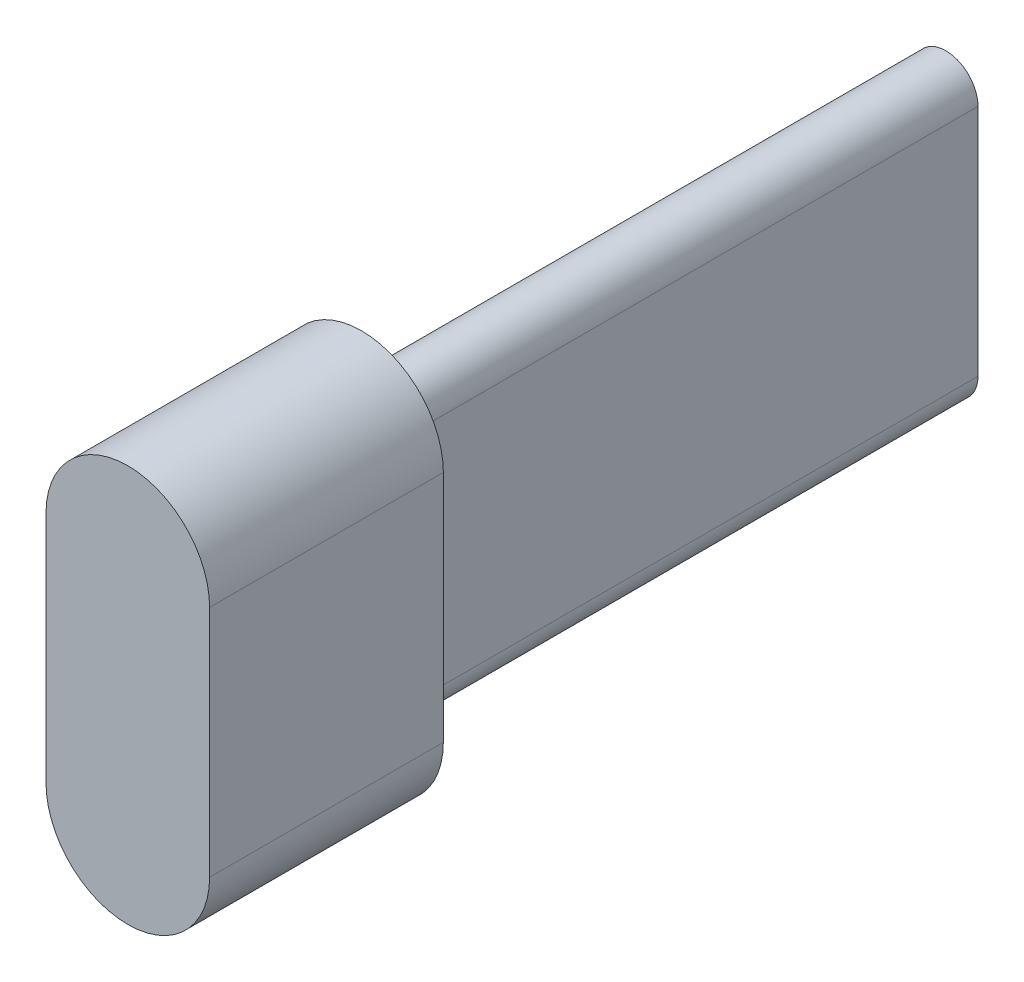
ISO-10303-21;
HEADER;
FILE_DESCRIPTION(('STEP AP214'),'2;1');
FILE_NAME('part.step','',(''),(''),'','','');
FILE_SCHEMA(('AUTOMOTIVE_DESIGN { 1 0 10303 214 1 1 1 1 }'));
ENDSEC;
DATA;
#1=APPLICATION_CONTEXT('core data for automotive mechanical design processes');
#2=APPLICATION_PROTOCOL_DEFINITION('international standard','automotive_design',2000,#1);
#3=PRODUCT_CONTEXT('',#1,'mechanical');
#4=PRODUCT('Part','Part','',(#3));
#5=PRODUCT_RELATED_PRODUCT_CATEGORY('part','',(#4));
#6=PRODUCT_DEFINITION_FORMATION('','',#4);
#7=PRODUCT_DEFINITION_CONTEXT('part definition',#1,'design');
#8=PRODUCT_DEFINITION('design','',#6,#7);
#9=PRODUCT_DEFINITION_SHAPE('','',#8);
#10=(LENGTH_UNIT() NAMED_UNIT(*) SI_UNIT(.MILLI.,.METRE.));
#11=(NAMED_UNIT(*) PLANE_ANGLE_UNIT() SI_UNIT($,.RADIAN.));
#12=(NAMED_UNIT(*) SI_UNIT($,.STERADIAN.) SOLID_ANGLE_UNIT());
#13=UNCERTAINTY_MEASURE_WITH_UNIT(LENGTH_MEASURE(1.E-05),#10,'distance_accuracy_value','');
#14=(GEOMETRIC_REPRESENTATION_CONTEXT(3) GLOBAL_UNCERTAINTY_ASSIGNED_CONTEXT((#13)) GLOBAL_UNIT_ASSIGNED_CONTEXT((#10,
#11,#12)) REPRESENTATION_CONTEXT('',''));
#15=CARTESIAN_POINT('',(0.,0.,0.));
#16=DIRECTION('',(0.,0.,1.));
#17=DIRECTION('',(1.,0.,0.));
#18=AXIS2_PLACEMENT_3D('',#15,#16,#17);
#19=CARTESIAN_POINT('',(-5.3532180263906,-26.1185094078407,-20.));
#20=DIRECTION('',(0.,0.,1.));
#21=DIRECTION('',(1.,0.,0.));
#22=AXIS2_PLACEMENT_3D('',#19,#20,#21);
#23=CYLINDRICAL_SURFACE('',#22,1.1);
#24=CARTESIAN_POINT('',(-5.3532180263906,-26.1185094078407,0.));
#25=DIRECTION('',(0.,0.,1.));
#26=DIRECTION('',(1.,0.,0.));
#27=AXIS2_PLACEMENT_3D('',#24,#25,#26);
#28=CIRCLE('',#27,1.1);
#29=CARTESIAN_POINT('',(-4.25321802639058,-26.1185094078407,0.));
#30=VERTEX_POINT('',#29);
#31=CARTESIAN_POINT('',(-6.45321802639058,-26.1185094078407,0.));
#32=VERTEX_POINT('',#31);
#33=EDGE_CURVE('E136',#30,#32,#28,.T.);
#34=ORIENTED_EDGE('',*,*,#33,.F.);
#35=DIRECTION('',(0.,0.,1.));
#36=VECTOR('',#35,1.);
#37=CARTESIAN_POINT('',(-4.25321802639058,-26.1185094078407,-20.));
#38=LINE('',#37,#36);
#39=CARTESIAN_POINT('',(-4.25321802639058,-26.1185094078407,-20.));
#40=VERTEX_POINT('',#39);
#41=EDGE_CURVE('E11',#40,#30,#38,.T.);
#42=ORIENTED_EDGE('',*,*,#41,.F.);
#43=CARTESIAN_POINT('',(-5.3532180263906,-26.1185094078407,-20.));
#44=DIRECTION('',(0.,0.,1.));
#45=DIRECTION('',(1.,0.,0.));
#46=AXIS2_PLACEMENT_3D('',#43,#44,#45);
#47=CIRCLE('',#46,1.1);
#48=CARTESIAN_POINT('',(-6.45321802639058,-26.1185094078407,-20.));
#49=VERTEX_POINT('',#48);
#50=EDGE_CURVE('E145',#40,#49,#47,.T.);
#51=ORIENTED_EDGE('',*,*,#50,.T.);
#52=DIRECTION('',(0.,0.,1.));
#53=VECTOR('',#52,1.);
#54=CARTESIAN_POINT('',(-6.45321802639058,-26.1185094078407,-20.));
#55=LINE('',#54,#53);
#56=EDGE_CURVE('E44',#49,#32,#55,.T.);
#57=ORIENTED_EDGE('',*,*,#56,.T.);
#58=EDGE_LOOP('',(#34,#42,#51,#57));
#59=FACE_BOUND('',#58,.T.);
#60=ADVANCED_FACE('F41',(#59),#23,.T.);
#61=CARTESIAN_POINT('',(-4.25321802639059,-34.1185094078407,-20.));
#62=DIRECTION('',(1.,0.,0.));
#63=DIRECTION('',(0.,1.,0.));
#64=AXIS2_PLACEMENT_3D('',#61,#62,#63);
#65=PLANE('',#64);
#66=DIRECTION('',(0.,1.,0.));
#67=VECTOR('',#66,1.);
#68=CARTESIAN_POINT('',(-4.25321802639059,-34.1185094078407,0.));
#69=LINE('',#68,#67);
#70=CARTESIAN_POINT('',(-4.25321802639061,-34.1185094078407,0.));
#71=VERTEX_POINT('',#70);
#72=EDGE_CURVE('E148',#71,#30,#69,.T.);
#73=ORIENTED_EDGE('',*,*,#72,.F.);
#74=DIRECTION('',(0.,0.,1.));
#75=VECTOR('',#74,1.);
#76=CARTESIAN_POINT('',(-4.25321802639061,-34.1185094078407,-20.));
#77=LINE('',#76,#75);
#78=CARTESIAN_POINT('',(-4.25321802639061,-34.1185094078407,-20.));
#79=VERTEX_POINT('',#78);
#80=EDGE_CURVE('E50',#79,#71,#77,.T.);
#81=ORIENTED_EDGE('',*,*,#80,.F.);
#82=DIRECTION('',(0.,1.,0.));
#83=VECTOR('',#82,1.);
#84=CARTESIAN_POINT('',(-4.25321802639059,-34.1185094078407,-20.));
#85=LINE('',#84,#83);
#86=EDGE_CURVE('E152',#79,#40,#85,.T.);
#87=ORIENTED_EDGE('',*,*,#86,.T.);
#88=ORIENTED_EDGE('',*,*,#41,.T.);
#89=EDGE_LOOP('',(#73,#81,#87,#88));
#90=FACE_BOUND('',#89,.T.);
#91=ADVANCED_FACE('F166',(#90),#65,.T.);
#92=CARTESIAN_POINT('',(-5.3532180263906,-34.1185094078407,-20.));
#93=DIRECTION('',(0.,0.,1.));
#94=DIRECTION('',(1.,0.,0.));
#95=AXIS2_PLACEMENT_3D('',#92,#93,#94);
#96=CYLINDRICAL_SURFACE('',#95,1.09999999999999);
#97=CARTESIAN_POINT('',(-5.3532180263906,-34.1185094078407,0.));
#98=DIRECTION('',(0.,0.,1.));
#99=DIRECTION('',(1.,0.,0.));
#100=AXIS2_PLACEMENT_3D('',#97,#98,#99);
#101=CIRCLE('',#100,1.09999999999999);
#102=CARTESIAN_POINT('',(-6.45321802639058,-34.1185094078407,0.));
#103=VERTEX_POINT('',#102);
#104=EDGE_CURVE('E157',#103,#71,#101,.T.);
#105=ORIENTED_EDGE('',*,*,#104,.F.);
#106=DIRECTION('',(0.,0.,1.));
#107=VECTOR('',#106,1.);
#108=CARTESIAN_POINT('',(-6.45321802639058,-34.1185094078407,-20.));
#109=LINE('',#108,#107);
#110=CARTESIAN_POINT('',(-6.45321802639058,-34.1185094078407,-20.));
#111=VERTEX_POINT('',#110);
#112=EDGE_CURVE('E73',#111,#103,#109,.T.);
#113=ORIENTED_EDGE('',*,*,#112,.F.);
#114=CARTESIAN_POINT('',(-5.3532180263906,-34.1185094078407,-20.));
#115=DIRECTION('',(0.,0.,1.));
#116=DIRECTION('',(1.,0.,0.));
#117=AXIS2_PLACEMENT_3D('',#114,#115,#116);
#118=CIRCLE('',#117,1.09999999999999);
#119=EDGE_CURVE('E150',#111,#79,#118,.T.);
#120=ORIENTED_EDGE('',*,*,#119,.T.);
#121=ORIENTED_EDGE('',*,*,#80,.T.);
#122=EDGE_LOOP('',(#105,#113,#120,#121));
#123=FACE_BOUND('',#122,.T.);
#124=ADVANCED_FACE('F171',(#123),#96,.T.);
#125=CARTESIAN_POINT('',(-6.45321802639058,-26.1185094078407,-20.));
#126=DIRECTION('',(-1.,0.,0.));
#127=DIRECTION('',(0.,0.,1.));
#128=AXIS2_PLACEMENT_3D('',#125,#126,#127);
#129=PLANE('',#128);
#130=DIRECTION('',(0.,-1.,0.));
#131=VECTOR('',#130,1.);
#132=CARTESIAN_POINT('',(-6.45321802639058,-26.1185094078407,0.));
#133=LINE('',#132,#131);
#134=EDGE_CURVE('E139',#32,#103,#133,.T.);
#135=ORIENTED_EDGE('',*,*,#134,.F.);
#136=ORIENTED_EDGE('',*,*,#56,.F.);
#137=DIRECTION('',(0.,-1.,0.));
#138=VECTOR('',#137,1.);
#139=CARTESIAN_POINT('',(-6.45321802639058,-26.1185094078407,-20.));
#140=LINE('',#139,#138);
#141=EDGE_CURVE('E147',#49,#111,#140,.T.);
#142=ORIENTED_EDGE('',*,*,#141,.T.);
#143=ORIENTED_EDGE('',*,*,#112,.T.);
#144=EDGE_LOOP('',(#135,#136,#142,#143));
#145=FACE_BOUND('',#144,.T.);
#146=ADVANCED_FACE('F162',(#145),#129,.T.);
#147=CARTESIAN_POINT('',(-5.3532180263906,-26.1185094078407,-20.));
#148=DIRECTION('',(0.,0.,1.));
#149=DIRECTION('',(1.,0.,0.));
#150=AXIS2_PLACEMENT_3D('',#147,#148,#149);
#151=PLANE('',#150);
#152=ORIENTED_EDGE('',*,*,#50,.F.);
#153=ORIENTED_EDGE('',*,*,#86,.F.);
#154=ORIENTED_EDGE('',*,*,#119,.F.);
#155=ORIENTED_EDGE('',*,*,#141,.F.);
#156=EDGE_LOOP('',(#152,#153,#154,#155));
#157=FACE_BOUND('',#156,.T.);
#158=ADVANCED_FACE('F170',(#157),#151,.F.);
#159=CARTESIAN_POINT('',(0.,0.,0.));
#160=DIRECTION('',(0.,0.,1.));
#161=DIRECTION('',(1.,0.,0.));
#162=AXIS2_PLACEMENT_3D('',#159,#160,#161);
#163=PLANE('',#162);
#164=DIRECTION('',(0.,1.,0.));
#165=VECTOR('',#164,1.);
#166=CARTESIAN_POINT('',(-2.55321802639055,0.,0.));
#167=LINE('',#166,#165);
#168=CARTESIAN_POINT('',(-2.55321802639064,-34.1185094078407,0.));
#169=VERTEX_POINT('',#168);
#170=CARTESIAN_POINT('',(-2.55321802639061,-26.1185094078407,0.));
#171=VERTEX_POINT('',#170);
#172=EDGE_CURVE('E135',#169,#171,#167,.T.);
#173=ORIENTED_EDGE('',*,*,#172,.F.);
#174=CARTESIAN_POINT('',(-5.3532180263906,-34.1185094078407,0.));
#175=DIRECTION('',(0.,0.,1.));
#176=DIRECTION('',(1.,0.,0.));
#177=AXIS2_PLACEMENT_3D('',#174,#175,#176);
#178=CIRCLE('',#177,2.79999999999996);
#179=CARTESIAN_POINT('',(-8.15321802639056,-34.1185094078407,0.));
#180=VERTEX_POINT('',#179);
#181=EDGE_CURVE('E131',#180,#169,#178,.T.);
#182=ORIENTED_EDGE('',*,*,#181,.F.);
#183=DIRECTION('',(0.,-1.,0.));
#184=VECTOR('',#183,1.);
#185=CARTESIAN_POINT('',(-8.15321802639056,0.,0.));
#186=LINE('',#185,#184);
#187=CARTESIAN_POINT('',(-8.15321802639056,-26.1185094078407,0.));
#188=VERTEX_POINT('',#187);
#189=EDGE_CURVE('E290',#188,#180,#186,.T.);
#190=ORIENTED_EDGE('',*,*,#189,.F.);
#191=CARTESIAN_POINT('',(-5.3532180263906,-26.1185094078407,0.));
#192=DIRECTION('',(0.,0.,1.));
#193=DIRECTION('',(1.,0.,0.));
#194=AXIS2_PLACEMENT_3D('',#191,#192,#193);
#195=CIRCLE('',#194,2.79999999999997);
#196=EDGE_CURVE('E293',#171,#188,#195,.T.);
#197=ORIENTED_EDGE('',*,*,#196,.F.);
#198=EDGE_LOOP('',(#173,#182,#190,#197));
#199=FACE_BOUND('',#198,.T.);
#200=ORIENTED_EDGE('',*,*,#72,.T.);
#201=ORIENTED_EDGE('',*,*,#33,.T.);
#202=ORIENTED_EDGE('',*,*,#134,.T.);
#203=ORIENTED_EDGE('',*,*,#104,.T.);
#204=EDGE_LOOP('',(#200,#201,#202,#203));
#205=FACE_BOUND('',#204,.T.);
#206=ADVANCED_FACE('F164',(#199,#205),#163,.F.);
#207=CARTESIAN_POINT('',(-2.55321802639055,0.,8.));
#208=DIRECTION('',(-1.,0.,0.));
#209=DIRECTION('',(0.,-1.,0.));
#210=AXIS2_PLACEMENT_3D('',#207,#208,#209);
#211=PLANE('',#210);
#212=ORIENTED_EDGE('',*,*,#172,.T.);
#213=DIRECTION('',(0.,0.,-1.));
#214=VECTOR('',#213,1.);
#215=CARTESIAN_POINT('',(-2.55321802639061,-26.1185094078407,8.));
#216=LINE('',#215,#214);
#217=CARTESIAN_POINT('',(-2.55321802639061,-26.1185094078407,8.));
#218=VERTEX_POINT('',#217);
#219=EDGE_CURVE('E115',#218,#171,#216,.T.);
#220=ORIENTED_EDGE('',*,*,#219,.F.);
#221=DIRECTION('',(0.,1.,0.));
#222=VECTOR('',#221,1.);
#223=CARTESIAN_POINT('',(-2.55321802639055,0.,8.));
#224=LINE('',#223,#222);
#225=CARTESIAN_POINT('',(-2.55321802639064,-34.1185094078407,8.));
#226=VERTEX_POINT('',#225);
#227=EDGE_CURVE('E122',#226,#218,#224,.T.);
#228=ORIENTED_EDGE('',*,*,#227,.F.);
#229=DIRECTION('',(0.,0.,-1.));
#230=VECTOR('',#229,1.);
#231=CARTESIAN_POINT('',(-2.55321802639064,-34.1185094078407,8.));
#232=LINE('',#231,#230);
#233=EDGE_CURVE('E287',#226,#169,#232,.T.);
#234=ORIENTED_EDGE('',*,*,#233,.T.);
#235=EDGE_LOOP('',(#212,#220,#228,#234));
#236=FACE_BOUND('',#235,.T.);
#237=ADVANCED_FACE('F133',(#236),#211,.F.);
#238=CARTESIAN_POINT('',(-5.3532180263906,-26.1185094078407,8.));
#239=DIRECTION('',(0.,0.,-1.));
#240=DIRECTION('',(-1.,0.,0.));
#241=AXIS2_PLACEMENT_3D('',#238,#239,#240);
#242=CYLINDRICAL_SURFACE('',#241,2.79999999999997);
#243=ORIENTED_EDGE('',*,*,#196,.T.);
#244=DIRECTION('',(0.,0.,-1.));
#245=VECTOR('',#244,1.);
#246=CARTESIAN_POINT('',(-8.15321802639056,-26.1185094078407,8.));
#247=LINE('',#246,#245);
#248=CARTESIAN_POINT('',(-8.15321802639056,-26.1185094078407,8.));
#249=VERTEX_POINT('',#248);
#250=EDGE_CURVE('E118',#249,#188,#247,.T.);
#251=ORIENTED_EDGE('',*,*,#250,.F.);
#252=CARTESIAN_POINT('',(-5.3532180263906,-26.1185094078407,8.));
#253=DIRECTION('',(0.,0.,1.));
#254=DIRECTION('',(1.,0.,0.));
#255=AXIS2_PLACEMENT_3D('',#252,#253,#254);
#256=CIRCLE('',#255,2.79999999999997);
#257=EDGE_CURVE('E111',#218,#249,#256,.T.);
#258=ORIENTED_EDGE('',*,*,#257,.F.);
#259=ORIENTED_EDGE('',*,*,#219,.T.);
#260=EDGE_LOOP('',(#243,#251,#258,#259));
#261=FACE_BOUND('',#260,.T.);
#262=ADVANCED_FACE('F113',(#261),#242,.T.);
#263=CARTESIAN_POINT('',(-8.15321802639056,0.,8.));
#264=DIRECTION('',(1.,0.,0.));
#265=DIRECTION('',(0.,0.,-1.));
#266=AXIS2_PLACEMENT_3D('',#263,#264,#265);
#267=PLANE('',#266);
#268=ORIENTED_EDGE('',*,*,#189,.T.);
#269=DIRECTION('',(0.,0.,-1.));
#270=VECTOR('',#269,1.);
#271=CARTESIAN_POINT('',(-8.15321802639056,-34.1185094078407,8.));
#272=LINE('',#271,#270);
#273=CARTESIAN_POINT('',(-8.15321802639056,-34.1185094078407,8.));
#274=VERTEX_POINT('',#273);
#275=EDGE_CURVE('E141',#274,#180,#272,.T.);
#276=ORIENTED_EDGE('',*,*,#275,.F.);
#277=DIRECTION('',(0.,-1.,0.));
#278=VECTOR('',#277,1.);
#279=CARTESIAN_POINT('',(-8.15321802639056,0.,8.));
#280=LINE('',#279,#278);
#281=EDGE_CURVE('E121',#249,#274,#280,.T.);
#282=ORIENTED_EDGE('',*,*,#281,.F.);
#283=ORIENTED_EDGE('',*,*,#250,.T.);
#284=EDGE_LOOP('',(#268,#276,#282,#283));
#285=FACE_BOUND('',#284,.T.);
#286=ADVANCED_FACE('F230',(#285),#267,.F.);
#287=CARTESIAN_POINT('',(-5.3532180263906,-34.1185094078407,8.));
#288=DIRECTION('',(0.,0.,-1.));
#289=DIRECTION('',(-1.,0.,0.));
#290=AXIS2_PLACEMENT_3D('',#287,#288,#289);
#291=CYLINDRICAL_SURFACE('',#290,2.79999999999996);
#292=ORIENTED_EDGE('',*,*,#181,.T.);
#293=ORIENTED_EDGE('',*,*,#233,.F.);
#294=CARTESIAN_POINT('',(-5.3532180263906,-34.1185094078407,8.));
#295=DIRECTION('',(0.,0.,1.));
#296=DIRECTION('',(1.,0.,0.));
#297=AXIS2_PLACEMENT_3D('',#294,#295,#296);
#298=CIRCLE('',#297,2.79999999999996);
#299=EDGE_CURVE('E127',#274,#226,#298,.T.);
#300=ORIENTED_EDGE('',*,*,#299,.F.);
#301=ORIENTED_EDGE('',*,*,#275,.T.);
#302=EDGE_LOOP('',(#292,#293,#300,#301));
#303=FACE_BOUND('',#302,.T.);
#304=ADVANCED_FACE('F240',(#303),#291,.T.);
#305=CARTESIAN_POINT('',(0.,0.,8.));
#306=DIRECTION('',(0.,0.,1.));
#307=DIRECTION('',(1.,0.,0.));
#308=AXIS2_PLACEMENT_3D('',#305,#306,#307);
#309=PLANE('',#308);
#310=ORIENTED_EDGE('',*,*,#227,.T.);
#311=ORIENTED_EDGE('',*,*,#257,.T.);
#312=ORIENTED_EDGE('',*,*,#281,.T.);
#313=ORIENTED_EDGE('',*,*,#299,.T.);
#314=EDGE_LOOP('',(#310,#311,#312,#313));
#315=FACE_BOUND('',#314,.T.);
#316=ADVANCED_FACE('F125',(#315),#309,.T.);
#317=CLOSED_SHELL('',(#60,#91,#124,#146,#158,#206,#237,#262,#286,#304,#316));
#318=MANIFOLD_SOLID_BREP('B2',#317);
#319=ADVANCED_BREP_SHAPE_REPRESENTATION('',(#18,#318),#14);
#320=SHAPE_DEFINITION_REPRESENTATION(#9,#319);
ENDSEC;
END-ISO-10303-21;
